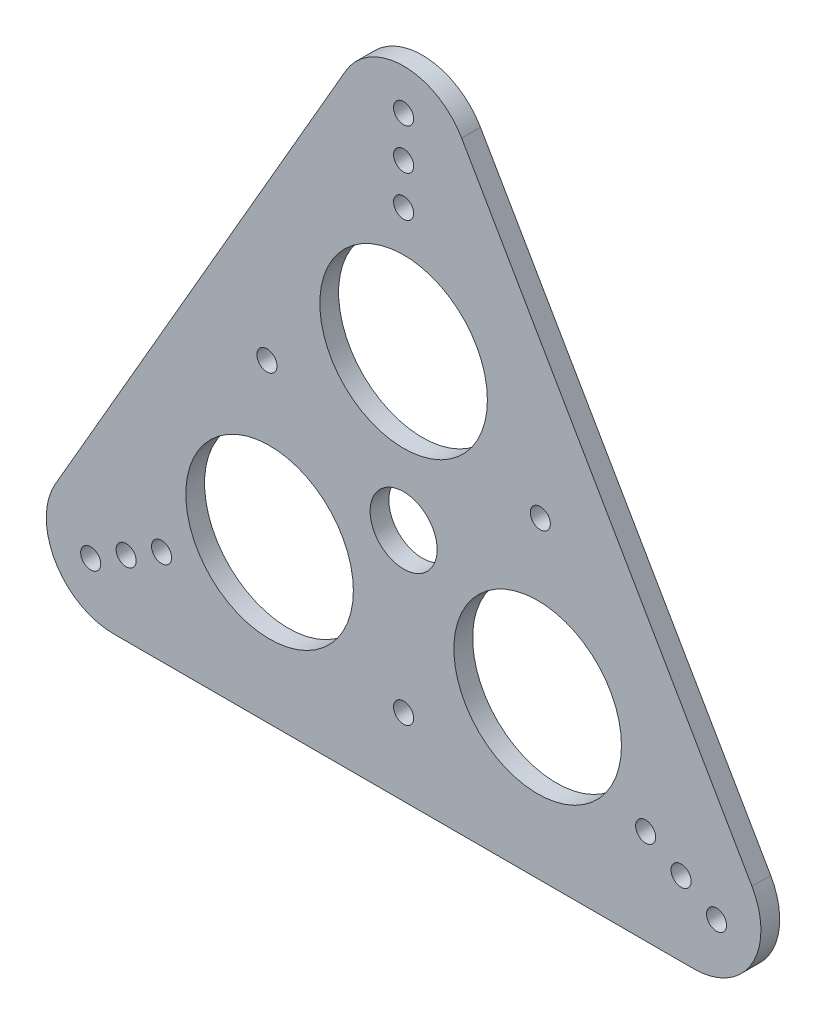
ISO-10303-21;
HEADER;
FILE_DESCRIPTION(('STEP AP214'),'2;1');
FILE_NAME('part.step','',(''),(''),'','','');
FILE_SCHEMA(('AUTOMOTIVE_DESIGN { 1 0 10303 214 1 1 1 1 }'));
ENDSEC;
DATA;
#1=APPLICATION_CONTEXT('core data for automotive mechanical design processes');
#2=APPLICATION_PROTOCOL_DEFINITION('international standard','automotive_design',2000,#1);
#3=PRODUCT_CONTEXT('',#1,'mechanical');
#4=PRODUCT('Part','Part','',(#3));
#5=PRODUCT_RELATED_PRODUCT_CATEGORY('part','',(#4));
#6=PRODUCT_DEFINITION_FORMATION('','',#4);
#7=PRODUCT_DEFINITION_CONTEXT('part definition',#1,'design');
#8=PRODUCT_DEFINITION('design','',#6,#7);
#9=PRODUCT_DEFINITION_SHAPE('','',#8);
#10=(LENGTH_UNIT() NAMED_UNIT(*) SI_UNIT(.MILLI.,.METRE.));
#11=(NAMED_UNIT(*) PLANE_ANGLE_UNIT() SI_UNIT($,.RADIAN.));
#12=(NAMED_UNIT(*) SI_UNIT($,.STERADIAN.) SOLID_ANGLE_UNIT());
#13=UNCERTAINTY_MEASURE_WITH_UNIT(LENGTH_MEASURE(1.E-05),#10,'distance_accuracy_value','');
#14=(GEOMETRIC_REPRESENTATION_CONTEXT(3) GLOBAL_UNCERTAINTY_ASSIGNED_CONTEXT((#13)) GLOBAL_UNIT_ASSIGNED_CONTEXT((#10,
#11,#12)) REPRESENTATION_CONTEXT('',''));
#15=CARTESIAN_POINT('',(0.,0.,0.));
#16=DIRECTION('',(0.,0.,1.));
#17=DIRECTION('',(1.,0.,0.));
#18=AXIS2_PLACEMENT_3D('',#15,#16,#17);
#19=CARTESIAN_POINT('',(52.2099865002436,98.6851109535946,2.8));
#20=DIRECTION('',(0.,0.,1.));
#21=DIRECTION('',(1.,0.,0.));
#22=AXIS2_PLACEMENT_3D('',#19,#20,#21);
#23=PLANE('',#22);
#24=CARTESIAN_POINT('',(131.618020836748,102.838860953595,2.8));
#25=DIRECTION('',(0.,0.,1.));
#26=DIRECTION('',(1.,0.,0.));
#27=AXIS2_PLACEMENT_3D('',#24,#25,#26);
#28=CIRCLE('',#27,1.5);
#29=CARTESIAN_POINT('',(133.118020836748,102.838860953595,2.8));
#30=VERTEX_POINT('',#29);
#31=EDGE_CURVE('E240',#30,#30,#28,.T.);
#32=ORIENTED_EDGE('',*,*,#31,.F.);
#33=EDGE_LOOP('',(#32));
#34=FACE_BOUND('',#33,.T.);
#35=CARTESIAN_POINT('',(142.187860889937,96.7363609535946,2.8));
#36=DIRECTION('',(0.,0.,1.));
#37=DIRECTION('',(1.,0.,0.));
#38=AXIS2_PLACEMENT_3D('',#35,#36,#37);
#39=CIRCLE('',#38,1.5);
#40=CARTESIAN_POINT('',(143.687860889937,96.7363609535946,2.8));
#41=VERTEX_POINT('',#40);
#42=EDGE_CURVE('E252',#41,#41,#39,.T.);
#43=ORIENTED_EDGE('',*,*,#42,.F.);
#44=EDGE_LOOP('',(#43));
#45=FACE_BOUND('',#44,.T.);
#46=CARTESIAN_POINT('',(54.1195725155883,99.7876109535947,2.8));
#47=DIRECTION('',(0.,0.,1.));
#48=DIRECTION('',(1.,0.,0.));
#49=AXIS2_PLACEMENT_3D('',#46,#47,#48);
#50=CIRCLE('',#49,1.5);
#51=CARTESIAN_POINT('',(55.6195725155883,99.7876109535947,2.8));
#52=VERTEX_POINT('',#51);
#53=EDGE_CURVE('E264',#52,#52,#50,.T.);
#54=ORIENTED_EDGE('',*,*,#53,.F.);
#55=EDGE_LOOP('',(#54));
#56=FACE_BOUND('',#55,.T.);
#57=CARTESIAN_POINT('',(95.5112566894656,165.377610953595,2.8));
#58=DIRECTION('',(0.,0.,1.));
#59=DIRECTION('',(1.,0.,0.));
#60=AXIS2_PLACEMENT_3D('',#57,#58,#59);
#61=CIRCLE('',#60,1.5);
#62=CARTESIAN_POINT('',(97.0112566894656,165.377610953595,2.8));
#63=VERTEX_POINT('',#62);
#64=EDGE_CURVE('E276',#63,#63,#61,.T.);
#65=ORIENTED_EDGE('',*,*,#64,.F.);
#66=EDGE_LOOP('',(#65));
#67=FACE_BOUND('',#66,.T.);
#68=CARTESIAN_POINT('',(95.5112566894656,177.582610953595,2.8));
#69=DIRECTION('',(0.,0.,1.));
#70=DIRECTION('',(1.,0.,0.));
#71=AXIS2_PLACEMENT_3D('',#68,#69,#70);
#72=CIRCLE('',#71,1.5);
#73=CARTESIAN_POINT('',(97.0112566894656,177.582610953595,2.8));
#74=VERTEX_POINT('',#73);
#75=EDGE_CURVE('E288',#74,#74,#72,.T.);
#76=ORIENTED_EDGE('',*,*,#75,.F.);
#77=EDGE_LOOP('',(#76));
#78=FACE_BOUND('',#77,.T.);
#79=CARTESIAN_POINT('',(115.90182482157,135.457610953595,2.8));
#80=DIRECTION('',(0.,0.,1.));
#81=DIRECTION('',(1.,0.,0.));
#82=AXIS2_PLACEMENT_3D('',#79,#80,#81);
#83=CIRCLE('',#82,1.5);
#84=CARTESIAN_POINT('',(117.40182482157,135.457610953595,2.8));
#85=VERTEX_POINT('',#84);
#86=EDGE_CURVE('E300',#85,#85,#83,.T.);
#87=ORIENTED_EDGE('',*,*,#86,.F.);
#88=EDGE_LOOP('',(#87));
#89=FACE_BOUND('',#88,.T.);
#90=CARTESIAN_POINT('',(115.507783262848,112.140110953595,2.8));
#91=DIRECTION('',(0.,0.,1.));
#92=DIRECTION('',(1.,0.,0.));
#93=AXIS2_PLACEMENT_3D('',#90,#91,#92);
#94=CIRCLE('',#93,12.5);
#95=CARTESIAN_POINT('',(128.007783262848,112.140110953595,2.8));
#96=VERTEX_POINT('',#95);
#97=EDGE_CURVE('E312',#96,#96,#94,.T.);
#98=ORIENTED_EDGE('',*,*,#97,.F.);
#99=EDGE_LOOP('',(#98));
#100=FACE_BOUND('',#99,.T.);
#101=CARTESIAN_POINT('',(95.5112566894656,146.775110953595,2.8));
#102=DIRECTION('',(0.,0.,1.));
#103=DIRECTION('',(1.,0.,0.));
#104=AXIS2_PLACEMENT_3D('',#101,#102,#103);
#105=CIRCLE('',#104,12.5);
#106=CARTESIAN_POINT('',(108.011256689466,146.775110953595,2.8));
#107=VERTEX_POINT('',#106);
#108=EDGE_CURVE('E125',#107,#107,#105,.T.);
#109=ORIENTED_EDGE('',*,*,#108,.F.);
#110=EDGE_LOOP('',(#109));
#111=FACE_BOUND('',#110,.T.);
#112=CARTESIAN_POINT('',(52.2099865002436,98.6851109535946,2.8));
#113=DIRECTION('',(0.,0.,1.));
#114=DIRECTION('',(1.,0.,0.));
#115=AXIS2_PLACEMENT_3D('',#112,#113,#114);
#116=CIRCLE('',#115,10.);
#117=CARTESIAN_POINT('',(43.5497324623992,103.685110953595,2.8));
#118=VERTEX_POINT('',#117);
#119=CARTESIAN_POINT('',(52.2099865002436,88.6851109535946,2.8));
#120=VERTEX_POINT('',#119);
#121=EDGE_CURVE('E132',#118,#120,#116,.T.);
#122=ORIENTED_EDGE('',*,*,#121,.T.);
#123=DIRECTION('',(1.,0.,0.));
#124=VECTOR('',#123,1.);
#125=CARTESIAN_POINT('',(52.2099865002436,88.6851109535946,2.8));
#126=LINE('',#125,#124);
#127=CARTESIAN_POINT('',(138.812526878687,88.6851109535946,2.8));
#128=VERTEX_POINT('',#127);
#129=EDGE_CURVE('E90',#120,#128,#126,.T.);
#130=ORIENTED_EDGE('',*,*,#129,.T.);
#131=CARTESIAN_POINT('',(138.812526878687,98.6851109535946,2.8));
#132=DIRECTION('',(0.,0.,1.));
#133=DIRECTION('',(1.,0.,0.));
#134=AXIS2_PLACEMENT_3D('',#131,#132,#133);
#135=CIRCLE('',#134,9.99999999999999);
#136=CARTESIAN_POINT('',(147.472780916532,103.685110953595,2.8));
#137=VERTEX_POINT('',#136);
#138=EDGE_CURVE('E103',#128,#137,#135,.T.);
#139=ORIENTED_EDGE('',*,*,#138,.T.);
#140=DIRECTION('',(-0.5,0.866025403784439,0.));
#141=VECTOR('',#140,1.);
#142=CARTESIAN_POINT('',(147.472780916532,103.685110953595,2.8));
#143=LINE('',#142,#141);
#144=CARTESIAN_POINT('',(104.17151072731,178.685110953595,2.8));
#145=VERTEX_POINT('',#144);
#146=EDGE_CURVE('E97',#137,#145,#143,.T.);
#147=ORIENTED_EDGE('',*,*,#146,.T.);
#148=CARTESIAN_POINT('',(95.5112566894656,173.685110953595,2.8));
#149=DIRECTION('',(0.,0.,1.));
#150=DIRECTION('',(1.,0.,0.));
#151=AXIS2_PLACEMENT_3D('',#148,#149,#150);
#152=CIRCLE('',#151,10.);
#153=CARTESIAN_POINT('',(86.8510026516212,178.685110953595,2.8));
#154=VERTEX_POINT('',#153);
#155=EDGE_CURVE('E101',#145,#154,#152,.T.);
#156=ORIENTED_EDGE('',*,*,#155,.T.);
#157=DIRECTION('',(-0.5,-0.866025403784438,0.));
#158=VECTOR('',#157,1.);
#159=CARTESIAN_POINT('',(86.8510026516212,178.685110953595,2.8));
#160=LINE('',#159,#158);
#161=EDGE_CURVE('E53',#154,#118,#160,.T.);
#162=ORIENTED_EDGE('',*,*,#161,.T.);
#163=EDGE_LOOP('',(#122,#130,#139,#147,#156,#162));
#164=FACE_BOUND('',#163,.T.);
#165=CARTESIAN_POINT('',(75.5147301160829,112.140110953595,2.8));
#166=DIRECTION('',(0.,0.,1.));
#167=DIRECTION('',(1.,0.,0.));
#168=AXIS2_PLACEMENT_3D('',#165,#166,#167);
#169=CIRCLE('',#168,12.5);
#170=CARTESIAN_POINT('',(88.0147301160829,112.140110953595,2.8));
#171=VERTEX_POINT('',#170);
#172=EDGE_CURVE('E318',#171,#171,#169,.T.);
#173=ORIENTED_EDGE('',*,*,#172,.F.);
#174=EDGE_LOOP('',(#173));
#175=FACE_BOUND('',#174,.T.);
#176=CARTESIAN_POINT('',(95.5112566894656,100.140110953595,2.8));
#177=DIRECTION('',(0.,0.,1.));
#178=DIRECTION('',(1.,0.,0.));
#179=AXIS2_PLACEMENT_3D('',#176,#177,#178);
#180=CIRCLE('',#179,1.5);
#181=CARTESIAN_POINT('',(97.0112566894656,100.140110953595,2.8));
#182=VERTEX_POINT('',#181);
#183=EDGE_CURVE('E306',#182,#182,#180,.T.);
#184=ORIENTED_EDGE('',*,*,#183,.F.);
#185=EDGE_LOOP('',(#184));
#186=FACE_BOUND('',#185,.T.);
#187=CARTESIAN_POINT('',(75.120688557361,135.457610953595,2.8));
#188=DIRECTION('',(0.,0.,1.));
#189=DIRECTION('',(1.,0.,0.));
#190=AXIS2_PLACEMENT_3D('',#187,#188,#189);
#191=CIRCLE('',#190,1.5);
#192=CARTESIAN_POINT('',(76.620688557361,135.457610953595,2.8));
#193=VERTEX_POINT('',#192);
#194=EDGE_CURVE('E294',#193,#193,#191,.T.);
#195=ORIENTED_EDGE('',*,*,#194,.F.);
#196=EDGE_LOOP('',(#195));
#197=FACE_BOUND('',#196,.T.);
#198=CARTESIAN_POINT('',(95.5112566894656,171.480110953595,2.8));
#199=DIRECTION('',(0.,0.,1.));
#200=DIRECTION('',(1.,0.,0.));
#201=AXIS2_PLACEMENT_3D('',#198,#199,#200);
#202=CIRCLE('',#201,1.5);
#203=CARTESIAN_POINT('',(97.0112566894656,171.480110953595,2.8));
#204=VERTEX_POINT('',#203);
#205=EDGE_CURVE('E282',#204,#204,#202,.T.);
#206=ORIENTED_EDGE('',*,*,#205,.F.);
#207=EDGE_LOOP('',(#206));
#208=FACE_BOUND('',#207,.T.);
#209=CARTESIAN_POINT('',(48.8346524889938,96.7363609535946,2.8));
#210=DIRECTION('',(0.,0.,1.));
#211=DIRECTION('',(1.,0.,0.));
#212=AXIS2_PLACEMENT_3D('',#209,#210,#211);
#213=CIRCLE('',#212,1.5);
#214=CARTESIAN_POINT('',(50.3346524889938,96.7363609535946,2.8));
#215=VERTEX_POINT('',#214);
#216=EDGE_CURVE('E270',#215,#215,#213,.T.);
#217=ORIENTED_EDGE('',*,*,#216,.F.);
#218=EDGE_LOOP('',(#217));
#219=FACE_BOUND('',#218,.T.);
#220=CARTESIAN_POINT('',(59.4044925421829,102.838860953595,2.8));
#221=DIRECTION('',(0.,0.,1.));
#222=DIRECTION('',(1.,0.,0.));
#223=AXIS2_PLACEMENT_3D('',#220,#221,#222);
#224=CIRCLE('',#223,1.5);
#225=CARTESIAN_POINT('',(60.9044925421829,102.838860953595,2.8));
#226=VERTEX_POINT('',#225);
#227=EDGE_CURVE('E258',#226,#226,#224,.T.);
#228=ORIENTED_EDGE('',*,*,#227,.F.);
#229=EDGE_LOOP('',(#228));
#230=FACE_BOUND('',#229,.T.);
#231=CARTESIAN_POINT('',(136.902940863343,99.7876109535946,2.8));
#232=DIRECTION('',(0.,0.,1.));
#233=DIRECTION('',(1.,0.,0.));
#234=AXIS2_PLACEMENT_3D('',#231,#232,#233);
#235=CIRCLE('',#234,1.5);
#236=CARTESIAN_POINT('',(138.402940863343,99.7876109535946,2.8));
#237=VERTEX_POINT('',#236);
#238=EDGE_CURVE('E246',#237,#237,#235,.T.);
#239=ORIENTED_EDGE('',*,*,#238,.F.);
#240=EDGE_LOOP('',(#239));
#241=FACE_BOUND('',#240,.T.);
#242=CARTESIAN_POINT('',(95.5112566894656,123.685110953595,2.8));
#243=DIRECTION('',(0.,0.,1.));
#244=DIRECTION('',(1.,0.,0.));
#245=AXIS2_PLACEMENT_3D('',#242,#243,#244);
#246=CIRCLE('',#245,5.);
#247=CARTESIAN_POINT('',(100.511256689466,123.685110953595,2.8));
#248=VERTEX_POINT('',#247);
#249=EDGE_CURVE('E231',#248,#248,#246,.T.);
#250=ORIENTED_EDGE('',*,*,#249,.F.);
#251=EDGE_LOOP('',(#250));
#252=FACE_BOUND('',#251,.T.);
#253=ADVANCED_FACE('F36',(#34,#45,#56,#67,#78,#89,#100,#111,#164,#175,#186,#197,#208,#219,#230,
#241,#252),#23,.T.);
#254=CARTESIAN_POINT('',(52.2099865002436,98.6851109535946,0.));
#255=DIRECTION('',(0.,0.,1.));
#256=DIRECTION('',(1.,0.,0.));
#257=AXIS2_PLACEMENT_3D('',#254,#255,#256);
#258=PLANE('',#257);
#259=CARTESIAN_POINT('',(52.2099865002436,98.6851109535946,0.));
#260=DIRECTION('',(0.,0.,1.));
#261=DIRECTION('',(1.,0.,0.));
#262=AXIS2_PLACEMENT_3D('',#259,#260,#261);
#263=CIRCLE('',#262,10.);
#264=CARTESIAN_POINT('',(43.5497324623992,103.685110953595,0.));
#265=VERTEX_POINT('',#264);
#266=CARTESIAN_POINT('',(52.2099865002436,88.6851109535946,0.));
#267=VERTEX_POINT('',#266);
#268=EDGE_CURVE('E121',#265,#267,#263,.T.);
#269=ORIENTED_EDGE('',*,*,#268,.F.);
#270=DIRECTION('',(-0.5,-0.866025403784438,0.));
#271=VECTOR('',#270,1.);
#272=CARTESIAN_POINT('',(86.8510026516212,178.685110953595,0.));
#273=LINE('',#272,#271);
#274=CARTESIAN_POINT('',(86.8510026516212,178.685110953595,0.));
#275=VERTEX_POINT('',#274);
#276=EDGE_CURVE('E82',#275,#265,#273,.T.);
#277=ORIENTED_EDGE('',*,*,#276,.F.);
#278=CARTESIAN_POINT('',(95.5112566894656,173.685110953595,0.));
#279=DIRECTION('',(0.,0.,1.));
#280=DIRECTION('',(1.,0.,0.));
#281=AXIS2_PLACEMENT_3D('',#278,#279,#280);
#282=CIRCLE('',#281,10.);
#283=CARTESIAN_POINT('',(104.17151072731,178.685110953595,0.));
#284=VERTEX_POINT('',#283);
#285=EDGE_CURVE('E76',#284,#275,#282,.T.);
#286=ORIENTED_EDGE('',*,*,#285,.F.);
#287=DIRECTION('',(-0.5,0.866025403784439,0.));
#288=VECTOR('',#287,1.);
#289=CARTESIAN_POINT('',(147.472780916532,103.685110953595,0.));
#290=LINE('',#289,#288);
#291=CARTESIAN_POINT('',(147.472780916532,103.685110953595,0.));
#292=VERTEX_POINT('',#291);
#293=EDGE_CURVE('E111',#292,#284,#290,.T.);
#294=ORIENTED_EDGE('',*,*,#293,.F.);
#295=CARTESIAN_POINT('',(138.812526878687,98.6851109535946,0.));
#296=DIRECTION('',(0.,0.,1.));
#297=DIRECTION('',(1.,0.,0.));
#298=AXIS2_PLACEMENT_3D('',#295,#296,#297);
#299=CIRCLE('',#298,9.99999999999999);
#300=CARTESIAN_POINT('',(138.812526878687,88.6851109535946,0.));
#301=VERTEX_POINT('',#300);
#302=EDGE_CURVE('E127',#301,#292,#299,.T.);
#303=ORIENTED_EDGE('',*,*,#302,.F.);
#304=DIRECTION('',(1.,0.,0.));
#305=VECTOR('',#304,1.);
#306=CARTESIAN_POINT('',(52.2099865002436,88.6851109535946,0.));
#307=LINE('',#306,#305);
#308=EDGE_CURVE('E124',#267,#301,#307,.T.);
#309=ORIENTED_EDGE('',*,*,#308,.F.);
#310=EDGE_LOOP('',(#269,#277,#286,#294,#303,#309));
#311=FACE_BOUND('',#310,.T.);
#312=CARTESIAN_POINT('',(95.5112566894656,146.775110953595,0.));
#313=DIRECTION('',(0.,0.,1.));
#314=DIRECTION('',(1.,0.,0.));
#315=AXIS2_PLACEMENT_3D('',#312,#313,#314);
#316=CIRCLE('',#315,12.5);
#317=CARTESIAN_POINT('',(108.011256689466,146.775110953595,0.));
#318=VERTEX_POINT('',#317);
#319=EDGE_CURVE('E321',#318,#318,#316,.T.);
#320=ORIENTED_EDGE('',*,*,#319,.T.);
#321=EDGE_LOOP('',(#320));
#322=FACE_BOUND('',#321,.T.);
#323=CARTESIAN_POINT('',(75.5147301160829,112.140110953595,0.));
#324=DIRECTION('',(0.,0.,1.));
#325=DIRECTION('',(1.,0.,0.));
#326=AXIS2_PLACEMENT_3D('',#323,#324,#325);
#327=CIRCLE('',#326,12.5);
#328=CARTESIAN_POINT('',(88.0147301160829,112.140110953595,0.));
#329=VERTEX_POINT('',#328);
#330=EDGE_CURVE('E315',#329,#329,#327,.T.);
#331=ORIENTED_EDGE('',*,*,#330,.T.);
#332=EDGE_LOOP('',(#331));
#333=FACE_BOUND('',#332,.T.);
#334=CARTESIAN_POINT('',(115.507783262848,112.140110953595,0.));
#335=DIRECTION('',(0.,0.,1.));
#336=DIRECTION('',(1.,0.,0.));
#337=AXIS2_PLACEMENT_3D('',#334,#335,#336);
#338=CIRCLE('',#337,12.5);
#339=CARTESIAN_POINT('',(128.007783262848,112.140110953595,0.));
#340=VERTEX_POINT('',#339);
#341=EDGE_CURVE('E309',#340,#340,#338,.T.);
#342=ORIENTED_EDGE('',*,*,#341,.T.);
#343=EDGE_LOOP('',(#342));
#344=FACE_BOUND('',#343,.T.);
#345=CARTESIAN_POINT('',(95.5112566894656,100.140110953595,0.));
#346=DIRECTION('',(0.,0.,1.));
#347=DIRECTION('',(1.,0.,0.));
#348=AXIS2_PLACEMENT_3D('',#345,#346,#347);
#349=CIRCLE('',#348,1.5);
#350=CARTESIAN_POINT('',(97.0112566894656,100.140110953595,0.));
#351=VERTEX_POINT('',#350);
#352=EDGE_CURVE('E303',#351,#351,#349,.T.);
#353=ORIENTED_EDGE('',*,*,#352,.T.);
#354=EDGE_LOOP('',(#353));
#355=FACE_BOUND('',#354,.T.);
#356=CARTESIAN_POINT('',(115.90182482157,135.457610953595,0.));
#357=DIRECTION('',(0.,0.,1.));
#358=DIRECTION('',(1.,0.,0.));
#359=AXIS2_PLACEMENT_3D('',#356,#357,#358);
#360=CIRCLE('',#359,1.5);
#361=CARTESIAN_POINT('',(117.40182482157,135.457610953595,0.));
#362=VERTEX_POINT('',#361);
#363=EDGE_CURVE('E297',#362,#362,#360,.T.);
#364=ORIENTED_EDGE('',*,*,#363,.T.);
#365=EDGE_LOOP('',(#364));
#366=FACE_BOUND('',#365,.T.);
#367=CARTESIAN_POINT('',(75.120688557361,135.457610953595,0.));
#368=DIRECTION('',(0.,0.,1.));
#369=DIRECTION('',(1.,0.,0.));
#370=AXIS2_PLACEMENT_3D('',#367,#368,#369);
#371=CIRCLE('',#370,1.5);
#372=CARTESIAN_POINT('',(76.620688557361,135.457610953595,0.));
#373=VERTEX_POINT('',#372);
#374=EDGE_CURVE('E291',#373,#373,#371,.T.);
#375=ORIENTED_EDGE('',*,*,#374,.T.);
#376=EDGE_LOOP('',(#375));
#377=FACE_BOUND('',#376,.T.);
#378=CARTESIAN_POINT('',(95.5112566894656,177.582610953595,0.));
#379=DIRECTION('',(0.,0.,1.));
#380=DIRECTION('',(1.,0.,0.));
#381=AXIS2_PLACEMENT_3D('',#378,#379,#380);
#382=CIRCLE('',#381,1.5);
#383=CARTESIAN_POINT('',(97.0112566894656,177.582610953595,0.));
#384=VERTEX_POINT('',#383);
#385=EDGE_CURVE('E285',#384,#384,#382,.T.);
#386=ORIENTED_EDGE('',*,*,#385,.T.);
#387=EDGE_LOOP('',(#386));
#388=FACE_BOUND('',#387,.T.);
#389=CARTESIAN_POINT('',(95.5112566894656,171.480110953595,0.));
#390=DIRECTION('',(0.,0.,1.));
#391=DIRECTION('',(1.,0.,0.));
#392=AXIS2_PLACEMENT_3D('',#389,#390,#391);
#393=CIRCLE('',#392,1.5);
#394=CARTESIAN_POINT('',(97.0112566894656,171.480110953595,0.));
#395=VERTEX_POINT('',#394);
#396=EDGE_CURVE('E279',#395,#395,#393,.T.);
#397=ORIENTED_EDGE('',*,*,#396,.T.);
#398=EDGE_LOOP('',(#397));
#399=FACE_BOUND('',#398,.T.);
#400=CARTESIAN_POINT('',(95.5112566894656,165.377610953595,0.));
#401=DIRECTION('',(0.,0.,1.));
#402=DIRECTION('',(1.,0.,0.));
#403=AXIS2_PLACEMENT_3D('',#400,#401,#402);
#404=CIRCLE('',#403,1.5);
#405=CARTESIAN_POINT('',(97.0112566894656,165.377610953595,0.));
#406=VERTEX_POINT('',#405);
#407=EDGE_CURVE('E273',#406,#406,#404,.T.);
#408=ORIENTED_EDGE('',*,*,#407,.T.);
#409=EDGE_LOOP('',(#408));
#410=FACE_BOUND('',#409,.T.);
#411=CARTESIAN_POINT('',(48.8346524889938,96.7363609535946,0.));
#412=DIRECTION('',(0.,0.,1.));
#413=DIRECTION('',(1.,0.,0.));
#414=AXIS2_PLACEMENT_3D('',#411,#412,#413);
#415=CIRCLE('',#414,1.5);
#416=CARTESIAN_POINT('',(50.3346524889938,96.7363609535946,0.));
#417=VERTEX_POINT('',#416);
#418=EDGE_CURVE('E267',#417,#417,#415,.T.);
#419=ORIENTED_EDGE('',*,*,#418,.T.);
#420=EDGE_LOOP('',(#419));
#421=FACE_BOUND('',#420,.T.);
#422=CARTESIAN_POINT('',(54.1195725155883,99.7876109535947,0.));
#423=DIRECTION('',(0.,0.,1.));
#424=DIRECTION('',(1.,0.,0.));
#425=AXIS2_PLACEMENT_3D('',#422,#423,#424);
#426=CIRCLE('',#425,1.5);
#427=CARTESIAN_POINT('',(55.6195725155883,99.7876109535947,0.));
#428=VERTEX_POINT('',#427);
#429=EDGE_CURVE('E261',#428,#428,#426,.T.);
#430=ORIENTED_EDGE('',*,*,#429,.T.);
#431=EDGE_LOOP('',(#430));
#432=FACE_BOUND('',#431,.T.);
#433=CARTESIAN_POINT('',(59.4044925421829,102.838860953595,0.));
#434=DIRECTION('',(0.,0.,1.));
#435=DIRECTION('',(1.,0.,0.));
#436=AXIS2_PLACEMENT_3D('',#433,#434,#435);
#437=CIRCLE('',#436,1.5);
#438=CARTESIAN_POINT('',(60.9044925421829,102.838860953595,0.));
#439=VERTEX_POINT('',#438);
#440=EDGE_CURVE('E255',#439,#439,#437,.T.);
#441=ORIENTED_EDGE('',*,*,#440,.T.);
#442=EDGE_LOOP('',(#441));
#443=FACE_BOUND('',#442,.T.);
#444=CARTESIAN_POINT('',(142.187860889937,96.7363609535946,0.));
#445=DIRECTION('',(0.,0.,1.));
#446=DIRECTION('',(1.,0.,0.));
#447=AXIS2_PLACEMENT_3D('',#444,#445,#446);
#448=CIRCLE('',#447,1.5);
#449=CARTESIAN_POINT('',(143.687860889937,96.7363609535946,0.));
#450=VERTEX_POINT('',#449);
#451=EDGE_CURVE('E249',#450,#450,#448,.T.);
#452=ORIENTED_EDGE('',*,*,#451,.T.);
#453=EDGE_LOOP('',(#452));
#454=FACE_BOUND('',#453,.T.);
#455=CARTESIAN_POINT('',(136.902940863343,99.7876109535946,0.));
#456=DIRECTION('',(0.,0.,1.));
#457=DIRECTION('',(1.,0.,0.));
#458=AXIS2_PLACEMENT_3D('',#455,#456,#457);
#459=CIRCLE('',#458,1.5);
#460=CARTESIAN_POINT('',(138.402940863343,99.7876109535946,0.));
#461=VERTEX_POINT('',#460);
#462=EDGE_CURVE('E243',#461,#461,#459,.T.);
#463=ORIENTED_EDGE('',*,*,#462,.T.);
#464=EDGE_LOOP('',(#463));
#465=FACE_BOUND('',#464,.T.);
#466=CARTESIAN_POINT('',(131.618020836748,102.838860953595,0.));
#467=DIRECTION('',(0.,0.,1.));
#468=DIRECTION('',(1.,0.,0.));
#469=AXIS2_PLACEMENT_3D('',#466,#467,#468);
#470=CIRCLE('',#469,1.5);
#471=CARTESIAN_POINT('',(133.118020836748,102.838860953595,0.));
#472=VERTEX_POINT('',#471);
#473=EDGE_CURVE('E237',#472,#472,#470,.T.);
#474=ORIENTED_EDGE('',*,*,#473,.T.);
#475=EDGE_LOOP('',(#474));
#476=FACE_BOUND('',#475,.T.);
#477=CARTESIAN_POINT('',(95.5112566894656,123.685110953595,0.));
#478=DIRECTION('',(0.,0.,1.));
#479=DIRECTION('',(1.,0.,0.));
#480=AXIS2_PLACEMENT_3D('',#477,#478,#479);
#481=CIRCLE('',#480,5.);
#482=CARTESIAN_POINT('',(100.511256689466,123.685110953595,0.));
#483=VERTEX_POINT('',#482);
#484=EDGE_CURVE('E234',#483,#483,#481,.T.);
#485=ORIENTED_EDGE('',*,*,#484,.T.);
#486=EDGE_LOOP('',(#485));
#487=FACE_BOUND('',#486,.T.);
#488=ADVANCED_FACE('F141',(#311,#322,#333,#344,#355,#366,#377,#388,#399,#410,#421,#432,#443,
#454,#465,#476,#487),#258,.F.);
#489=CARTESIAN_POINT('',(52.2099865002436,98.6851109535946,2.8));
#490=DIRECTION('',(0.,0.,-1.));
#491=DIRECTION('',(-1.,0.,0.));
#492=AXIS2_PLACEMENT_3D('',#489,#490,#491);
#493=CYLINDRICAL_SURFACE('',#492,10.);
#494=ORIENTED_EDGE('',*,*,#268,.T.);
#495=DIRECTION('',(0.,0.,-1.));
#496=VECTOR('',#495,1.);
#497=CARTESIAN_POINT('',(52.2099865002436,88.6851109535946,2.8));
#498=LINE('',#497,#496);
#499=EDGE_CURVE('E11',#120,#267,#498,.T.);
#500=ORIENTED_EDGE('',*,*,#499,.F.);
#501=ORIENTED_EDGE('',*,*,#121,.F.);
#502=DIRECTION('',(0.,0.,-1.));
#503=VECTOR('',#502,1.);
#504=CARTESIAN_POINT('',(43.5497324623992,103.685110953595,2.8));
#505=LINE('',#504,#503);
#506=EDGE_CURVE('E117',#118,#265,#505,.T.);
#507=ORIENTED_EDGE('',*,*,#506,.T.);
#508=EDGE_LOOP('',(#494,#500,#501,#507));
#509=FACE_BOUND('',#508,.T.);
#510=ADVANCED_FACE('F38',(#509),#493,.T.);
#511=CARTESIAN_POINT('',(52.2099865002436,88.6851109535946,2.8));
#512=DIRECTION('',(0.,1.,0.));
#513=DIRECTION('',(-1.,0.,0.));
#514=AXIS2_PLACEMENT_3D('',#511,#512,#513);
#515=PLANE('',#514);
#516=ORIENTED_EDGE('',*,*,#308,.T.);
#517=DIRECTION('',(0.,0.,-1.));
#518=VECTOR('',#517,1.);
#519=CARTESIAN_POINT('',(138.812526878687,88.6851109535946,2.8));
#520=LINE('',#519,#518);
#521=EDGE_CURVE('E45',#128,#301,#520,.T.);
#522=ORIENTED_EDGE('',*,*,#521,.F.);
#523=ORIENTED_EDGE('',*,*,#129,.F.);
#524=ORIENTED_EDGE('',*,*,#499,.T.);
#525=EDGE_LOOP('',(#516,#522,#523,#524));
#526=FACE_BOUND('',#525,.T.);
#527=ADVANCED_FACE('F504',(#526),#515,.F.);
#528=CARTESIAN_POINT('',(138.812526878687,98.6851109535946,2.8));
#529=DIRECTION('',(0.,0.,-1.));
#530=DIRECTION('',(-1.,0.,0.));
#531=AXIS2_PLACEMENT_3D('',#528,#529,#530);
#532=CYLINDRICAL_SURFACE('',#531,9.99999999999999);
#533=ORIENTED_EDGE('',*,*,#302,.T.);
#534=DIRECTION('',(0.,0.,-1.));
#535=VECTOR('',#534,1.);
#536=CARTESIAN_POINT('',(147.472780916532,103.685110953595,2.8));
#537=LINE('',#536,#535);
#538=EDGE_CURVE('E112',#137,#292,#537,.T.);
#539=ORIENTED_EDGE('',*,*,#538,.F.);
#540=ORIENTED_EDGE('',*,*,#138,.F.);
#541=ORIENTED_EDGE('',*,*,#521,.T.);
#542=EDGE_LOOP('',(#533,#539,#540,#541));
#543=FACE_BOUND('',#542,.T.);
#544=ADVANCED_FACE('F138',(#543),#532,.T.);
#545=CARTESIAN_POINT('',(147.472780916532,103.685110953595,2.8));
#546=DIRECTION('',(-0.866025403784439,-0.5,0.));
#547=DIRECTION('',(0.5,-0.866025403784439,0.));
#548=AXIS2_PLACEMENT_3D('',#545,#546,#547);
#549=PLANE('',#548);
#550=ORIENTED_EDGE('',*,*,#293,.T.);
#551=DIRECTION('',(0.,0.,-1.));
#552=VECTOR('',#551,1.);
#553=CARTESIAN_POINT('',(104.17151072731,178.685110953595,2.8));
#554=LINE('',#553,#552);
#555=EDGE_CURVE('E108',#145,#284,#554,.T.);
#556=ORIENTED_EDGE('',*,*,#555,.F.);
#557=ORIENTED_EDGE('',*,*,#146,.F.);
#558=ORIENTED_EDGE('',*,*,#538,.T.);
#559=EDGE_LOOP('',(#550,#556,#557,#558));
#560=FACE_BOUND('',#559,.T.);
#561=ADVANCED_FACE('F109',(#560),#549,.F.);
#562=CARTESIAN_POINT('',(95.5112566894656,173.685110953595,2.8));
#563=DIRECTION('',(0.,0.,-1.));
#564=DIRECTION('',(-1.,0.,0.));
#565=AXIS2_PLACEMENT_3D('',#562,#563,#564);
#566=CYLINDRICAL_SURFACE('',#565,10.);
#567=ORIENTED_EDGE('',*,*,#285,.T.);
#568=DIRECTION('',(0.,0.,-1.));
#569=VECTOR('',#568,1.);
#570=CARTESIAN_POINT('',(86.8510026516212,178.685110953595,2.8));
#571=LINE('',#570,#569);
#572=EDGE_CURVE('E113',#154,#275,#571,.T.);
#573=ORIENTED_EDGE('',*,*,#572,.F.);
#574=ORIENTED_EDGE('',*,*,#155,.F.);
#575=ORIENTED_EDGE('',*,*,#555,.T.);
#576=EDGE_LOOP('',(#567,#573,#574,#575));
#577=FACE_BOUND('',#576,.T.);
#578=ADVANCED_FACE('F115',(#577),#566,.T.);
#579=CARTESIAN_POINT('',(86.8510026516212,178.685110953595,2.8));
#580=DIRECTION('',(0.866025403784438,-0.5,0.));
#581=DIRECTION('',(0.5,0.866025403784439,0.));
#582=AXIS2_PLACEMENT_3D('',#579,#580,#581);
#583=PLANE('',#582);
#584=ORIENTED_EDGE('',*,*,#276,.T.);
#585=ORIENTED_EDGE('',*,*,#506,.F.);
#586=ORIENTED_EDGE('',*,*,#161,.F.);
#587=ORIENTED_EDGE('',*,*,#572,.T.);
#588=EDGE_LOOP('',(#584,#585,#586,#587));
#589=FACE_BOUND('',#588,.T.);
#590=ADVANCED_FACE('F146',(#589),#583,.F.);
#591=CARTESIAN_POINT('',(95.5112566894656,146.775110953595,2.8));
#592=DIRECTION('',(0.,0.,-1.));
#593=DIRECTION('',(-1.,0.,0.));
#594=AXIS2_PLACEMENT_3D('',#591,#592,#593);
#595=CYLINDRICAL_SURFACE('',#594,12.5);
#596=ORIENTED_EDGE('',*,*,#108,.T.);
#597=EDGE_LOOP('',(#596));
#598=FACE_BOUND('',#597,.T.);
#599=ORIENTED_EDGE('',*,*,#319,.F.);
#600=EDGE_LOOP('',(#599));
#601=FACE_BOUND('',#600,.T.);
#602=ADVANCED_FACE('F148',(#598,#601),#595,.F.);
#603=CARTESIAN_POINT('',(75.5147301160829,112.140110953595,2.8));
#604=DIRECTION('',(0.,0.,-1.));
#605=DIRECTION('',(-1.,0.,0.));
#606=AXIS2_PLACEMENT_3D('',#603,#604,#605);
#607=CYLINDRICAL_SURFACE('',#606,12.5);
#608=ORIENTED_EDGE('',*,*,#172,.T.);
#609=EDGE_LOOP('',(#608));
#610=FACE_BOUND('',#609,.T.);
#611=ORIENTED_EDGE('',*,*,#330,.F.);
#612=EDGE_LOOP('',(#611));
#613=FACE_BOUND('',#612,.T.);
#614=ADVANCED_FACE('F154',(#610,#613),#607,.F.);
#615=CARTESIAN_POINT('',(115.507783262848,112.140110953595,2.8));
#616=DIRECTION('',(0.,0.,-1.));
#617=DIRECTION('',(-1.,0.,0.));
#618=AXIS2_PLACEMENT_3D('',#615,#616,#617);
#619=CYLINDRICAL_SURFACE('',#618,12.5);
#620=ORIENTED_EDGE('',*,*,#97,.T.);
#621=EDGE_LOOP('',(#620));
#622=FACE_BOUND('',#621,.T.);
#623=ORIENTED_EDGE('',*,*,#341,.F.);
#624=EDGE_LOOP('',(#623));
#625=FACE_BOUND('',#624,.T.);
#626=ADVANCED_FACE('F170',(#622,#625),#619,.F.);
#627=CARTESIAN_POINT('',(95.5112566894656,100.140110953595,2.8));
#628=DIRECTION('',(0.,0.,-1.));
#629=DIRECTION('',(-1.,0.,0.));
#630=AXIS2_PLACEMENT_3D('',#627,#628,#629);
#631=CYLINDRICAL_SURFACE('',#630,1.5);
#632=ORIENTED_EDGE('',*,*,#183,.T.);
#633=EDGE_LOOP('',(#632));
#634=FACE_BOUND('',#633,.T.);
#635=ORIENTED_EDGE('',*,*,#352,.F.);
#636=EDGE_LOOP('',(#635));
#637=FACE_BOUND('',#636,.T.);
#638=ADVANCED_FACE('F174',(#634,#637),#631,.F.);
#639=CARTESIAN_POINT('',(115.90182482157,135.457610953595,2.8));
#640=DIRECTION('',(0.,0.,-1.));
#641=DIRECTION('',(-1.,0.,0.));
#642=AXIS2_PLACEMENT_3D('',#639,#640,#641);
#643=CYLINDRICAL_SURFACE('',#642,1.5);
#644=ORIENTED_EDGE('',*,*,#86,.T.);
#645=EDGE_LOOP('',(#644));
#646=FACE_BOUND('',#645,.T.);
#647=ORIENTED_EDGE('',*,*,#363,.F.);
#648=EDGE_LOOP('',(#647));
#649=FACE_BOUND('',#648,.T.);
#650=ADVANCED_FACE('F178',(#646,#649),#643,.F.);
#651=CARTESIAN_POINT('',(75.120688557361,135.457610953595,2.8));
#652=DIRECTION('',(0.,0.,-1.));
#653=DIRECTION('',(-1.,0.,0.));
#654=AXIS2_PLACEMENT_3D('',#651,#652,#653);
#655=CYLINDRICAL_SURFACE('',#654,1.5);
#656=ORIENTED_EDGE('',*,*,#194,.T.);
#657=EDGE_LOOP('',(#656));
#658=FACE_BOUND('',#657,.T.);
#659=ORIENTED_EDGE('',*,*,#374,.F.);
#660=EDGE_LOOP('',(#659));
#661=FACE_BOUND('',#660,.T.);
#662=ADVANCED_FACE('F182',(#658,#661),#655,.F.);
#663=CARTESIAN_POINT('',(95.5112566894656,177.582610953595,2.8));
#664=DIRECTION('',(0.,0.,-1.));
#665=DIRECTION('',(-1.,0.,0.));
#666=AXIS2_PLACEMENT_3D('',#663,#664,#665);
#667=CYLINDRICAL_SURFACE('',#666,1.5);
#668=ORIENTED_EDGE('',*,*,#75,.T.);
#669=EDGE_LOOP('',(#668));
#670=FACE_BOUND('',#669,.T.);
#671=ORIENTED_EDGE('',*,*,#385,.F.);
#672=EDGE_LOOP('',(#671));
#673=FACE_BOUND('',#672,.T.);
#674=ADVANCED_FACE('F186',(#670,#673),#667,.F.);
#675=CARTESIAN_POINT('',(95.5112566894656,171.480110953595,2.8));
#676=DIRECTION('',(0.,0.,-1.));
#677=DIRECTION('',(-1.,0.,0.));
#678=AXIS2_PLACEMENT_3D('',#675,#676,#677);
#679=CYLINDRICAL_SURFACE('',#678,1.5);
#680=ORIENTED_EDGE('',*,*,#205,.T.);
#681=EDGE_LOOP('',(#680));
#682=FACE_BOUND('',#681,.T.);
#683=ORIENTED_EDGE('',*,*,#396,.F.);
#684=EDGE_LOOP('',(#683));
#685=FACE_BOUND('',#684,.T.);
#686=ADVANCED_FACE('F190',(#682,#685),#679,.F.);
#687=CARTESIAN_POINT('',(95.5112566894656,165.377610953595,2.8));
#688=DIRECTION('',(0.,0.,-1.));
#689=DIRECTION('',(-1.,0.,0.));
#690=AXIS2_PLACEMENT_3D('',#687,#688,#689);
#691=CYLINDRICAL_SURFACE('',#690,1.5);
#692=ORIENTED_EDGE('',*,*,#64,.T.);
#693=EDGE_LOOP('',(#692));
#694=FACE_BOUND('',#693,.T.);
#695=ORIENTED_EDGE('',*,*,#407,.F.);
#696=EDGE_LOOP('',(#695));
#697=FACE_BOUND('',#696,.T.);
#698=ADVANCED_FACE('F194',(#694,#697),#691,.F.);
#699=CARTESIAN_POINT('',(48.8346524889938,96.7363609535946,2.8));
#700=DIRECTION('',(0.,0.,-1.));
#701=DIRECTION('',(-1.,0.,0.));
#702=AXIS2_PLACEMENT_3D('',#699,#700,#701);
#703=CYLINDRICAL_SURFACE('',#702,1.5);
#704=ORIENTED_EDGE('',*,*,#216,.T.);
#705=EDGE_LOOP('',(#704));
#706=FACE_BOUND('',#705,.T.);
#707=ORIENTED_EDGE('',*,*,#418,.F.);
#708=EDGE_LOOP('',(#707));
#709=FACE_BOUND('',#708,.T.);
#710=ADVANCED_FACE('F198',(#706,#709),#703,.F.);
#711=CARTESIAN_POINT('',(54.1195725155883,99.7876109535947,2.8));
#712=DIRECTION('',(0.,0.,-1.));
#713=DIRECTION('',(-1.,0.,0.));
#714=AXIS2_PLACEMENT_3D('',#711,#712,#713);
#715=CYLINDRICAL_SURFACE('',#714,1.5);
#716=ORIENTED_EDGE('',*,*,#53,.T.);
#717=EDGE_LOOP('',(#716));
#718=FACE_BOUND('',#717,.T.);
#719=ORIENTED_EDGE('',*,*,#429,.F.);
#720=EDGE_LOOP('',(#719));
#721=FACE_BOUND('',#720,.T.);
#722=ADVANCED_FACE('F202',(#718,#721),#715,.F.);
#723=CARTESIAN_POINT('',(59.4044925421829,102.838860953595,2.8));
#724=DIRECTION('',(0.,0.,-1.));
#725=DIRECTION('',(-1.,0.,0.));
#726=AXIS2_PLACEMENT_3D('',#723,#724,#725);
#727=CYLINDRICAL_SURFACE('',#726,1.5);
#728=ORIENTED_EDGE('',*,*,#227,.T.);
#729=EDGE_LOOP('',(#728));
#730=FACE_BOUND('',#729,.T.);
#731=ORIENTED_EDGE('',*,*,#440,.F.);
#732=EDGE_LOOP('',(#731));
#733=FACE_BOUND('',#732,.T.);
#734=ADVANCED_FACE('F206',(#730,#733),#727,.F.);
#735=CARTESIAN_POINT('',(142.187860889937,96.7363609535946,2.8));
#736=DIRECTION('',(0.,0.,-1.));
#737=DIRECTION('',(-1.,0.,0.));
#738=AXIS2_PLACEMENT_3D('',#735,#736,#737);
#739=CYLINDRICAL_SURFACE('',#738,1.5);
#740=ORIENTED_EDGE('',*,*,#42,.T.);
#741=EDGE_LOOP('',(#740));
#742=FACE_BOUND('',#741,.T.);
#743=ORIENTED_EDGE('',*,*,#451,.F.);
#744=EDGE_LOOP('',(#743));
#745=FACE_BOUND('',#744,.T.);
#746=ADVANCED_FACE('F210',(#742,#745),#739,.F.);
#747=CARTESIAN_POINT('',(136.902940863343,99.7876109535946,2.8));
#748=DIRECTION('',(0.,0.,-1.));
#749=DIRECTION('',(-1.,0.,0.));
#750=AXIS2_PLACEMENT_3D('',#747,#748,#749);
#751=CYLINDRICAL_SURFACE('',#750,1.5);
#752=ORIENTED_EDGE('',*,*,#238,.T.);
#753=EDGE_LOOP('',(#752));
#754=FACE_BOUND('',#753,.T.);
#755=ORIENTED_EDGE('',*,*,#462,.F.);
#756=EDGE_LOOP('',(#755));
#757=FACE_BOUND('',#756,.T.);
#758=ADVANCED_FACE('F214',(#754,#757),#751,.F.);
#759=CARTESIAN_POINT('',(131.618020836748,102.838860953595,2.8));
#760=DIRECTION('',(0.,0.,-1.));
#761=DIRECTION('',(-1.,0.,0.));
#762=AXIS2_PLACEMENT_3D('',#759,#760,#761);
#763=CYLINDRICAL_SURFACE('',#762,1.5);
#764=ORIENTED_EDGE('',*,*,#31,.T.);
#765=EDGE_LOOP('',(#764));
#766=FACE_BOUND('',#765,.T.);
#767=ORIENTED_EDGE('',*,*,#473,.F.);
#768=EDGE_LOOP('',(#767));
#769=FACE_BOUND('',#768,.T.);
#770=ADVANCED_FACE('F218',(#766,#769),#763,.F.);
#771=CARTESIAN_POINT('',(95.5112566894656,123.685110953595,2.8));
#772=DIRECTION('',(0.,0.,-1.));
#773=DIRECTION('',(-1.,0.,0.));
#774=AXIS2_PLACEMENT_3D('',#771,#772,#773);
#775=CYLINDRICAL_SURFACE('',#774,5.);
#776=ORIENTED_EDGE('',*,*,#249,.T.);
#777=EDGE_LOOP('',(#776));
#778=FACE_BOUND('',#777,.T.);
#779=ORIENTED_EDGE('',*,*,#484,.F.);
#780=EDGE_LOOP('',(#779));
#781=FACE_BOUND('',#780,.T.);
#782=ADVANCED_FACE('F222',(#778,#781),#775,.F.);
#783=CLOSED_SHELL('',(#253,#488,#510,#527,#544,#561,#578,#590,#602,#614,#626,#638,#650,#662,
#674,#686,#698,#710,#722,#734,#746,#758,#770,#782));
#784=MANIFOLD_SOLID_BREP('B2',#783);
#785=ADVANCED_BREP_SHAPE_REPRESENTATION('',(#18,#784),#14);
#786=SHAPE_DEFINITION_REPRESENTATION(#9,#785);
ENDSEC;
END-ISO-10303-21;
